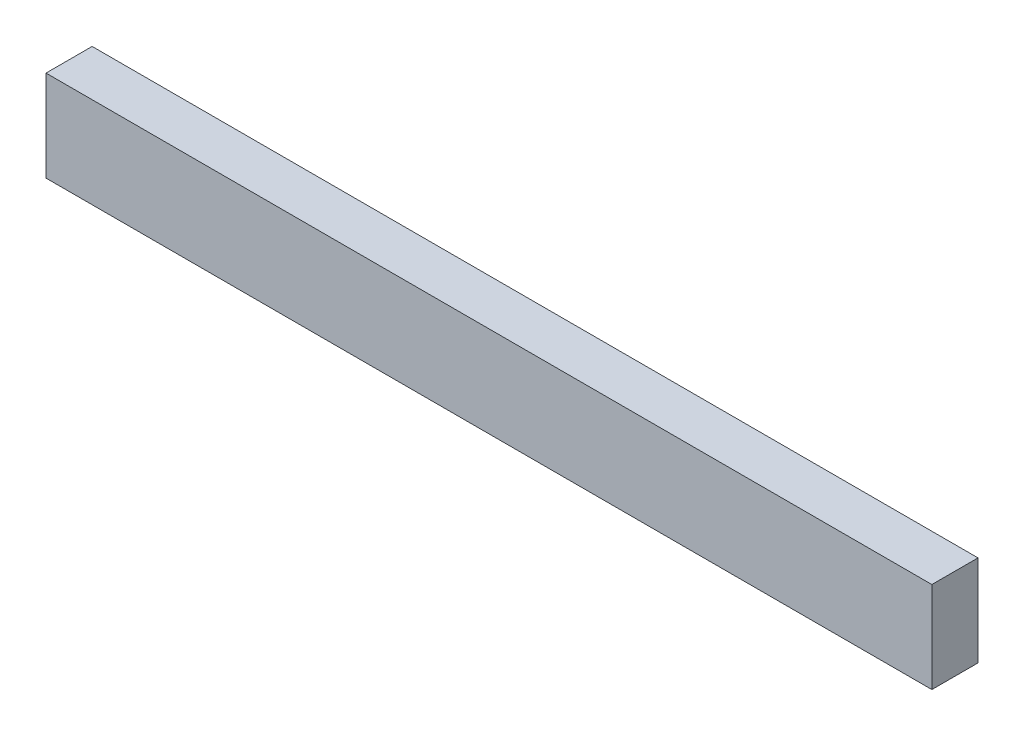
ISO-10303-21;
HEADER;
FILE_DESCRIPTION(('STEP AP214'),'2;1');
FILE_NAME('part.step','',(''),(''),'','','');
FILE_SCHEMA(('AUTOMOTIVE_DESIGN { 1 0 10303 214 1 1 1 1 }'));
ENDSEC;
DATA;
#1=APPLICATION_CONTEXT('core data for automotive mechanical design processes');
#2=APPLICATION_PROTOCOL_DEFINITION('international standard','automotive_design',2000,#1);
#3=PRODUCT_CONTEXT('',#1,'mechanical');
#4=PRODUCT('Part','Part','',(#3));
#5=PRODUCT_RELATED_PRODUCT_CATEGORY('part','',(#4));
#6=PRODUCT_DEFINITION_FORMATION('','',#4);
#7=PRODUCT_DEFINITION_CONTEXT('part definition',#1,'design');
#8=PRODUCT_DEFINITION('design','',#6,#7);
#9=PRODUCT_DEFINITION_SHAPE('','',#8);
#10=(LENGTH_UNIT() NAMED_UNIT(*) SI_UNIT(.MILLI.,.METRE.));
#11=(NAMED_UNIT(*) PLANE_ANGLE_UNIT() SI_UNIT($,.RADIAN.));
#12=(NAMED_UNIT(*) SI_UNIT($,.STERADIAN.) SOLID_ANGLE_UNIT());
#13=UNCERTAINTY_MEASURE_WITH_UNIT(LENGTH_MEASURE(1.E-05),#10,'distance_accuracy_value','');
#14=(GEOMETRIC_REPRESENTATION_CONTEXT(3) GLOBAL_UNCERTAINTY_ASSIGNED_CONTEXT((#13)) GLOBAL_UNIT_ASSIGNED_CONTEXT((#10,
#11,#12)) REPRESENTATION_CONTEXT('',''));
#15=CARTESIAN_POINT('',(0.,0.,0.));
#16=DIRECTION('',(0.,0.,1.));
#17=DIRECTION('',(1.,0.,0.));
#18=AXIS2_PLACEMENT_3D('',#15,#16,#17);
#19=CARTESIAN_POINT('',(24.,2.465,2.5));
#20=DIRECTION('',(-1.,0.,0.));
#21=DIRECTION('',(0.,0.,1.));
#22=AXIS2_PLACEMENT_3D('',#19,#20,#21);
#23=PLANE('',#22);
#24=DIRECTION('',(0.,1.,0.));
#25=VECTOR('',#24,1.);
#26=CARTESIAN_POINT('',(24.,2.465,0.));
#27=LINE('',#26,#25);
#28=CARTESIAN_POINT('',(24.,-2.465,0.));
#29=VERTEX_POINT('',#28);
#30=CARTESIAN_POINT('',(24.,2.465,0.));
#31=VERTEX_POINT('',#30);
#32=EDGE_CURVE('E95',#29,#31,#27,.T.);
#33=ORIENTED_EDGE('',*,*,#32,.T.);
#34=DIRECTION('',(0.,0.,-1.));
#35=VECTOR('',#34,1.);
#36=CARTESIAN_POINT('',(24.,2.465,2.5));
#37=LINE('',#36,#35);
#38=CARTESIAN_POINT('',(24.,2.465,2.5));
#39=VERTEX_POINT('',#38);
#40=EDGE_CURVE('E11',#39,#31,#37,.T.);
#41=ORIENTED_EDGE('',*,*,#40,.F.);
#42=DIRECTION('',(0.,1.,0.));
#43=VECTOR('',#42,1.);
#44=CARTESIAN_POINT('',(24.,2.465,2.5));
#45=LINE('',#44,#43);
#46=CARTESIAN_POINT('',(24.,-2.465,2.5));
#47=VERTEX_POINT('',#46);
#48=EDGE_CURVE('E83',#47,#39,#45,.T.);
#49=ORIENTED_EDGE('',*,*,#48,.F.);
#50=DIRECTION('',(0.,0.,-1.));
#51=VECTOR('',#50,1.);
#52=CARTESIAN_POINT('',(24.,-2.465,2.5));
#53=LINE('',#52,#51);
#54=EDGE_CURVE('E91',#47,#29,#53,.T.);
#55=ORIENTED_EDGE('',*,*,#54,.T.);
#56=EDGE_LOOP('',(#33,#41,#49,#55));
#57=FACE_BOUND('',#56,.T.);
#58=ADVANCED_FACE('F32',(#57),#23,.F.);
#59=CARTESIAN_POINT('',(-24.,2.465,2.5));
#60=DIRECTION('',(0.,-1.,0.));
#61=DIRECTION('',(0.,0.,-1.));
#62=AXIS2_PLACEMENT_3D('',#59,#60,#61);
#63=PLANE('',#62);
#64=DIRECTION('',(-1.,0.,0.));
#65=VECTOR('',#64,1.);
#66=CARTESIAN_POINT('',(-24.,2.465,0.));
#67=LINE('',#66,#65);
#68=CARTESIAN_POINT('',(-24.,2.465,0.));
#69=VERTEX_POINT('',#68);
#70=EDGE_CURVE('E87',#31,#69,#67,.T.);
#71=ORIENTED_EDGE('',*,*,#70,.T.);
#72=DIRECTION('',(0.,0.,-1.));
#73=VECTOR('',#72,1.);
#74=CARTESIAN_POINT('',(-24.,2.465,2.5));
#75=LINE('',#74,#73);
#76=CARTESIAN_POINT('',(-24.,2.465,2.5));
#77=VERTEX_POINT('',#76);
#78=EDGE_CURVE('E40',#77,#69,#75,.T.);
#79=ORIENTED_EDGE('',*,*,#78,.F.);
#80=DIRECTION('',(-1.,0.,0.));
#81=VECTOR('',#80,1.);
#82=CARTESIAN_POINT('',(-24.,2.465,2.5));
#83=LINE('',#82,#81);
#84=EDGE_CURVE('E78',#39,#77,#83,.T.);
#85=ORIENTED_EDGE('',*,*,#84,.F.);
#86=ORIENTED_EDGE('',*,*,#40,.T.);
#87=EDGE_LOOP('',(#71,#79,#85,#86));
#88=FACE_BOUND('',#87,.T.);
#89=ADVANCED_FACE('F86',(#88),#63,.F.);
#90=CARTESIAN_POINT('',(-24.,2.465,2.5));
#91=DIRECTION('',(1.,0.,0.));
#92=DIRECTION('',(0.,0.,-1.));
#93=AXIS2_PLACEMENT_3D('',#90,#91,#92);
#94=PLANE('',#93);
#95=DIRECTION('',(0.,-1.,0.));
#96=VECTOR('',#95,1.);
#97=CARTESIAN_POINT('',(-24.,2.465,0.));
#98=LINE('',#97,#96);
#99=CARTESIAN_POINT('',(-24.,-2.465,0.));
#100=VERTEX_POINT('',#99);
#101=EDGE_CURVE('E65',#69,#100,#98,.T.);
#102=ORIENTED_EDGE('',*,*,#101,.T.);
#103=DIRECTION('',(0.,0.,-1.));
#104=VECTOR('',#103,1.);
#105=CARTESIAN_POINT('',(-24.,-2.465,2.5));
#106=LINE('',#105,#104);
#107=CARTESIAN_POINT('',(-24.,-2.465,2.5));
#108=VERTEX_POINT('',#107);
#109=EDGE_CURVE('E88',#108,#100,#106,.T.);
#110=ORIENTED_EDGE('',*,*,#109,.F.);
#111=DIRECTION('',(0.,-1.,0.));
#112=VECTOR('',#111,1.);
#113=CARTESIAN_POINT('',(-24.,2.465,2.5));
#114=LINE('',#113,#112);
#115=EDGE_CURVE('E81',#77,#108,#114,.T.);
#116=ORIENTED_EDGE('',*,*,#115,.F.);
#117=ORIENTED_EDGE('',*,*,#78,.T.);
#118=EDGE_LOOP('',(#102,#110,#116,#117));
#119=FACE_BOUND('',#118,.T.);
#120=ADVANCED_FACE('F89',(#119),#94,.F.);
#121=CARTESIAN_POINT('',(-24.,-2.465,2.5));
#122=DIRECTION('',(0.,1.,0.));
#123=DIRECTION('',(0.,0.,1.));
#124=AXIS2_PLACEMENT_3D('',#121,#122,#123);
#125=PLANE('',#124);
#126=DIRECTION('',(1.,0.,0.));
#127=VECTOR('',#126,1.);
#128=CARTESIAN_POINT('',(-24.,-2.465,0.));
#129=LINE('',#128,#127);
#130=EDGE_CURVE('E71',#100,#29,#129,.T.);
#131=ORIENTED_EDGE('',*,*,#130,.T.);
#132=ORIENTED_EDGE('',*,*,#54,.F.);
#133=DIRECTION('',(1.,0.,0.));
#134=VECTOR('',#133,1.);
#135=CARTESIAN_POINT('',(-24.,-2.465,2.5));
#136=LINE('',#135,#134);
#137=EDGE_CURVE('E48',#108,#47,#136,.T.);
#138=ORIENTED_EDGE('',*,*,#137,.F.);
#139=ORIENTED_EDGE('',*,*,#109,.T.);
#140=EDGE_LOOP('',(#131,#132,#138,#139));
#141=FACE_BOUND('',#140,.T.);
#142=ADVANCED_FACE('F102',(#141),#125,.F.);
#143=CARTESIAN_POINT('',(0.,0.,2.5));
#144=DIRECTION('',(0.,0.,1.));
#145=DIRECTION('',(1.,0.,0.));
#146=AXIS2_PLACEMENT_3D('',#143,#144,#145);
#147=PLANE('',#146);
#148=ORIENTED_EDGE('',*,*,#48,.T.);
#149=ORIENTED_EDGE('',*,*,#84,.T.);
#150=ORIENTED_EDGE('',*,*,#115,.T.);
#151=ORIENTED_EDGE('',*,*,#137,.T.);
#152=EDGE_LOOP('',(#148,#149,#150,#151));
#153=FACE_BOUND('',#152,.T.);
#154=ADVANCED_FACE('F79',(#153),#147,.T.);
#155=CARTESIAN_POINT('',(0.,0.,0.));
#156=DIRECTION('',(0.,0.,1.));
#157=DIRECTION('',(1.,0.,0.));
#158=AXIS2_PLACEMENT_3D('',#155,#156,#157);
#159=PLANE('',#158);
#160=ORIENTED_EDGE('',*,*,#32,.F.);
#161=ORIENTED_EDGE('',*,*,#130,.F.);
#162=ORIENTED_EDGE('',*,*,#101,.F.);
#163=ORIENTED_EDGE('',*,*,#70,.F.);
#164=EDGE_LOOP('',(#160,#161,#162,#163));
#165=FACE_BOUND('',#164,.T.);
#166=ADVANCED_FACE('F105',(#165),#159,.F.);
#167=CLOSED_SHELL('',(#58,#89,#120,#142,#154,#166));
#168=MANIFOLD_SOLID_BREP('B2',#167);
#169=ADVANCED_BREP_SHAPE_REPRESENTATION('',(#18,#168),#14);
#170=SHAPE_DEFINITION_REPRESENTATION(#9,#169);
ENDSEC;
END-ISO-10303-21;
